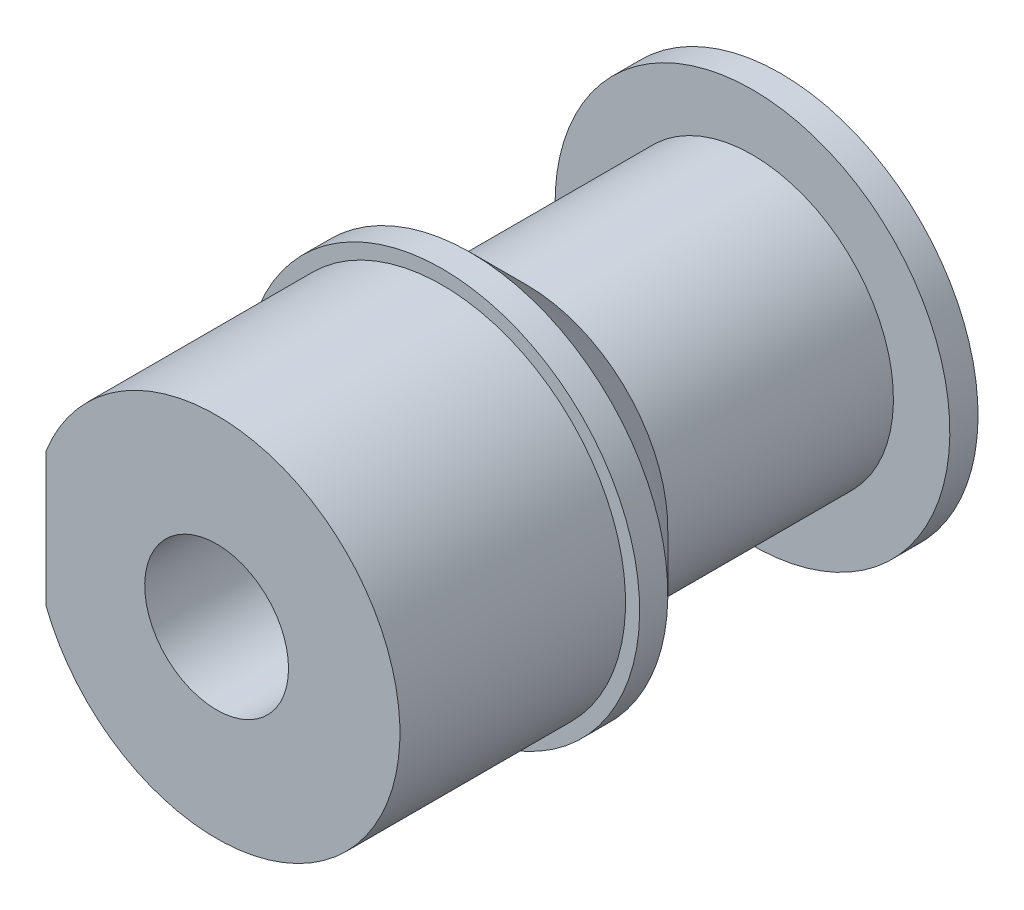
ISO-10303-21;
HEADER;
FILE_DESCRIPTION(('STEP AP214'),'2;1');
FILE_NAME('part.step','',(''),(''),'','','');
FILE_SCHEMA(('AUTOMOTIVE_DESIGN { 1 0 10303 214 1 1 1 1 }'));
ENDSEC;
DATA;
#1=APPLICATION_CONTEXT('core data for automotive mechanical design processes');
#2=APPLICATION_PROTOCOL_DEFINITION('international standard','automotive_design',2000,#1);
#3=PRODUCT_CONTEXT('',#1,'mechanical');
#4=PRODUCT('Part','Part','',(#3));
#5=PRODUCT_RELATED_PRODUCT_CATEGORY('part','',(#4));
#6=PRODUCT_DEFINITION_FORMATION('','',#4);
#7=PRODUCT_DEFINITION_CONTEXT('part definition',#1,'design');
#8=PRODUCT_DEFINITION('design','',#6,#7);
#9=PRODUCT_DEFINITION_SHAPE('','',#8);
#10=(LENGTH_UNIT() NAMED_UNIT(*) SI_UNIT(.MILLI.,.METRE.));
#11=(NAMED_UNIT(*) PLANE_ANGLE_UNIT() SI_UNIT($,.RADIAN.));
#12=(NAMED_UNIT(*) SI_UNIT($,.STERADIAN.) SOLID_ANGLE_UNIT());
#13=UNCERTAINTY_MEASURE_WITH_UNIT(LENGTH_MEASURE(1.E-05),#10,'distance_accuracy_value','');
#14=(GEOMETRIC_REPRESENTATION_CONTEXT(3) GLOBAL_UNCERTAINTY_ASSIGNED_CONTEXT((#13)) GLOBAL_UNIT_ASSIGNED_CONTEXT((#10,
#11,#12)) REPRESENTATION_CONTEXT('',''));
#15=CARTESIAN_POINT('',(0.,0.,0.));
#16=DIRECTION('',(0.,0.,1.));
#17=DIRECTION('',(1.,0.,0.));
#18=AXIS2_PLACEMENT_3D('',#15,#16,#17);
#19=CARTESIAN_POINT('',(0.,7.,0.));
#20=DIRECTION('',(0.,0.,-1.));
#21=DIRECTION('',(0.,1.,0.));
#22=AXIS2_PLACEMENT_3D('',#19,#20,#21);
#23=PLANE('',#22);
#24=CARTESIAN_POINT('',(0.,0.,0.));
#25=DIRECTION('',(0.,0.,-1.));
#26=DIRECTION('',(0.,1.,0.));
#27=AXIS2_PLACEMENT_3D('',#24,#25,#26);
#28=CIRCLE('',#27,7.);
#29=CARTESIAN_POINT('',(0.,7.,0.));
#30=VERTEX_POINT('',#29);
#31=EDGE_CURVE('E99',#30,#30,#28,.T.);
#32=ORIENTED_EDGE('',*,*,#31,.T.);
#33=EDGE_LOOP('',(#32));
#34=FACE_BOUND('',#33,.T.);
#35=DIRECTION('',(0.,1.,0.));
#36=VECTOR('',#35,1.);
#37=CARTESIAN_POINT('',(-2.05,7.,0.));
#38=LINE('',#37,#36);
#39=CARTESIAN_POINT('',(-2.05,1.51657508881031,0.));
#40=VERTEX_POINT('',#39);
#41=CARTESIAN_POINT('',(-2.05,-1.51657508881031,0.));
#42=VERTEX_POINT('',#41);
#43=EDGE_CURVE('E91',#40,#42,#38,.F.);
#44=ORIENTED_EDGE('',*,*,#43,.T.);
#45=CARTESIAN_POINT('',(0.,0.,0.));
#46=DIRECTION('',(0.,0.,-1.));
#47=DIRECTION('',(-1.,0.,0.));
#48=AXIS2_PLACEMENT_3D('',#45,#46,#47);
#49=CIRCLE('',#48,2.55);
#50=EDGE_CURVE('E36',#42,#40,#49,.F.);
#51=ORIENTED_EDGE('',*,*,#50,.T.);
#52=EDGE_LOOP('',(#44,#51));
#53=FACE_BOUND('',#52,.T.);
#54=ADVANCED_FACE('F33',(#34,#53),#23,.T.);
#55=CARTESIAN_POINT('',(0.,6.5,20.));
#56=DIRECTION('',(0.,0.,1.));
#57=DIRECTION('',(0.,-1.,0.));
#58=AXIS2_PLACEMENT_3D('',#55,#56,#57);
#59=PLANE('',#58);
#60=CARTESIAN_POINT('',(0.,0.,20.));
#61=DIRECTION('',(0.,0.,1.));
#62=DIRECTION('',(1.,0.,0.));
#63=AXIS2_PLACEMENT_3D('',#60,#61,#62);
#64=CIRCLE('',#63,2.55);
#65=CARTESIAN_POINT('',(2.55,0.,20.));
#66=VERTEX_POINT('',#65);
#67=EDGE_CURVE('E94',#66,#66,#64,.T.);
#68=ORIENTED_EDGE('',*,*,#67,.F.);
#69=EDGE_LOOP('',(#68));
#70=FACE_BOUND('',#69,.T.);
#71=DIRECTION('',(0.,1.,0.));
#72=VECTOR('',#71,1.);
#73=CARTESIAN_POINT('',(-6.05,-2.37644692766323,20.));
#74=LINE('',#73,#72);
#75=CARTESIAN_POINT('',(-6.05,-2.37644692766323,20.));
#76=VERTEX_POINT('',#75);
#77=CARTESIAN_POINT('',(-6.05,2.37644692766323,20.));
#78=VERTEX_POINT('',#77);
#79=EDGE_CURVE('E81',#76,#78,#74,.T.);
#80=ORIENTED_EDGE('',*,*,#79,.F.);
#81=CARTESIAN_POINT('',(0.,0.,20.));
#82=DIRECTION('',(0.,0.,-1.));
#83=DIRECTION('',(0.,1.,0.));
#84=AXIS2_PLACEMENT_3D('',#81,#82,#83);
#85=CIRCLE('',#84,6.5);
#86=EDGE_CURVE('E11',#78,#76,#85,.T.);
#87=ORIENTED_EDGE('',*,*,#86,.F.);
#88=EDGE_LOOP('',(#80,#87));
#89=FACE_BOUND('',#88,.T.);
#90=ADVANCED_FACE('F135',(#70,#89),#59,.T.);
#91=CARTESIAN_POINT('',(0.,0.,0.));
#92=DIRECTION('',(0.,0.,-1.));
#93=DIRECTION('',(0.,1.,0.));
#94=AXIS2_PLACEMENT_3D('',#91,#92,#93);
#95=CYLINDRICAL_SURFACE('',#94,6.5);
#96=DIRECTION('',(0.,0.,1.));
#97=VECTOR('',#96,1.);
#98=CARTESIAN_POINT('',(-6.05,-2.37644692766323,7.22585086114813));
#99=LINE('',#98,#97);
#100=CARTESIAN_POINT('',(-6.05,-2.37644692766323,12.));
#101=VERTEX_POINT('',#100);
#102=EDGE_CURVE('E126',#101,#76,#99,.T.);
#103=ORIENTED_EDGE('',*,*,#102,.F.);
#104=CARTESIAN_POINT('',(0.,0.,12.));
#105=DIRECTION('',(0.,0.,-1.));
#106=DIRECTION('',(0.,1.,0.));
#107=AXIS2_PLACEMENT_3D('',#104,#105,#106);
#108=CIRCLE('',#107,6.5);
#109=CARTESIAN_POINT('',(-6.05,2.37644692766323,12.));
#110=VERTEX_POINT('',#109);
#111=EDGE_CURVE('E41',#110,#101,#108,.T.);
#112=ORIENTED_EDGE('',*,*,#111,.F.);
#113=DIRECTION('',(0.,0.,1.));
#114=VECTOR('',#113,1.);
#115=CARTESIAN_POINT('',(-6.05,2.37644692766323,7.22585086114813));
#116=LINE('',#115,#114);
#117=EDGE_CURVE('E124',#110,#78,#116,.T.);
#118=ORIENTED_EDGE('',*,*,#117,.T.);
#119=ORIENTED_EDGE('',*,*,#86,.T.);
#120=EDGE_LOOP('',(#103,#112,#118,#119));
#121=FACE_BOUND('',#120,.T.);
#122=ADVANCED_FACE('F123',(#121),#95,.T.);
#123=CARTESIAN_POINT('',(0.,7.,12.));
#124=DIRECTION('',(0.,0.,1.));
#125=DIRECTION('',(0.,-1.,0.));
#126=AXIS2_PLACEMENT_3D('',#123,#124,#125);
#127=PLANE('',#126);
#128=ORIENTED_EDGE('',*,*,#111,.T.);
#129=DIRECTION('',(0.,-1.,0.));
#130=VECTOR('',#129,1.);
#131=CARTESIAN_POINT('',(-6.05,-2.37644692766323,12.));
#132=LINE('',#131,#130);
#133=EDGE_CURVE('E55',#110,#101,#132,.T.);
#134=ORIENTED_EDGE('',*,*,#133,.F.);
#135=EDGE_LOOP('',(#128,#134));
#136=FACE_BOUND('',#135,.T.);
#137=CARTESIAN_POINT('',(0.,0.,12.));
#138=DIRECTION('',(0.,0.,-1.));
#139=DIRECTION('',(0.,1.,0.));
#140=AXIS2_PLACEMENT_3D('',#137,#138,#139);
#141=CIRCLE('',#140,7.);
#142=CARTESIAN_POINT('',(0.,7.,12.));
#143=VERTEX_POINT('',#142);
#144=EDGE_CURVE('E114',#143,#143,#141,.T.);
#145=ORIENTED_EDGE('',*,*,#144,.F.);
#146=EDGE_LOOP('',(#145));
#147=FACE_BOUND('',#146,.T.);
#148=ADVANCED_FACE('F118',(#136,#147),#127,.T.);
#149=CARTESIAN_POINT('',(0.,0.,0.));
#150=DIRECTION('',(0.,0.,-1.));
#151=DIRECTION('',(0.,1.,0.));
#152=AXIS2_PLACEMENT_3D('',#149,#150,#151);
#153=CYLINDRICAL_SURFACE('',#152,7.);
#154=ORIENTED_EDGE('',*,*,#144,.T.);
#155=EDGE_LOOP('',(#154));
#156=FACE_BOUND('',#155,.T.);
#157=CARTESIAN_POINT('',(0.,0.,11.));
#158=DIRECTION('',(0.,0.,-1.));
#159=DIRECTION('',(0.,1.,0.));
#160=AXIS2_PLACEMENT_3D('',#157,#158,#159);
#161=CIRCLE('',#160,7.);
#162=CARTESIAN_POINT('',(0.,7.,11.));
#163=VERTEX_POINT('',#162);
#164=EDGE_CURVE('E111',#163,#163,#161,.T.);
#165=ORIENTED_EDGE('',*,*,#164,.F.);
#166=EDGE_LOOP('',(#165));
#167=FACE_BOUND('',#166,.T.);
#168=ADVANCED_FACE('F176',(#156,#167),#153,.T.);
#169=CARTESIAN_POINT('',(0.,0.,8.99999999999998));
#170=DIRECTION('',(0.,0.,1.));
#171=DIRECTION('',(0.,-1.,0.));
#172=AXIS2_PLACEMENT_3D('',#169,#170,#171);
#173=CONICAL_SURFACE('',#172,5.,0.785398163397443);
#174=ORIENTED_EDGE('',*,*,#164,.T.);
#175=EDGE_LOOP('',(#174));
#176=FACE_BOUND('',#175,.T.);
#177=CARTESIAN_POINT('',(0.,0.,8.99999999999998));
#178=DIRECTION('',(0.,0.,-1.));
#179=DIRECTION('',(0.,1.,0.));
#180=AXIS2_PLACEMENT_3D('',#177,#178,#179);
#181=CIRCLE('',#180,5.);
#182=CARTESIAN_POINT('',(0.,5.,8.99999999999998));
#183=VERTEX_POINT('',#182);
#184=EDGE_CURVE('E108',#183,#183,#181,.T.);
#185=ORIENTED_EDGE('',*,*,#184,.F.);
#186=EDGE_LOOP('',(#185));
#187=FACE_BOUND('',#186,.T.);
#188=ADVANCED_FACE('F172',(#176,#187),#173,.T.);
#189=CARTESIAN_POINT('',(0.,0.,0.));
#190=DIRECTION('',(0.,0.,-1.));
#191=DIRECTION('',(0.,1.,0.));
#192=AXIS2_PLACEMENT_3D('',#189,#190,#191);
#193=CYLINDRICAL_SURFACE('',#192,5.);
#194=ORIENTED_EDGE('',*,*,#184,.T.);
#195=EDGE_LOOP('',(#194));
#196=FACE_BOUND('',#195,.T.);
#197=CARTESIAN_POINT('',(0.,0.,0.999999999999999));
#198=DIRECTION('',(0.,0.,-1.));
#199=DIRECTION('',(0.,1.,0.));
#200=AXIS2_PLACEMENT_3D('',#197,#198,#199);
#201=CIRCLE('',#200,5.);
#202=CARTESIAN_POINT('',(0.,5.,1.));
#203=VERTEX_POINT('',#202);
#204=EDGE_CURVE('E105',#203,#203,#201,.T.);
#205=ORIENTED_EDGE('',*,*,#204,.F.);
#206=EDGE_LOOP('',(#205));
#207=FACE_BOUND('',#206,.T.);
#208=ADVANCED_FACE('F166',(#196,#207),#193,.T.);
#209=CARTESIAN_POINT('',(0.,5.,1.));
#210=DIRECTION('',(0.,0.,1.));
#211=DIRECTION('',(0.,-1.,0.));
#212=AXIS2_PLACEMENT_3D('',#209,#210,#211);
#213=PLANE('',#212);
#214=ORIENTED_EDGE('',*,*,#204,.T.);
#215=EDGE_LOOP('',(#214));
#216=FACE_BOUND('',#215,.T.);
#217=CARTESIAN_POINT('',(0.,0.,0.999999999999999));
#218=DIRECTION('',(0.,0.,-1.));
#219=DIRECTION('',(0.,1.,0.));
#220=AXIS2_PLACEMENT_3D('',#217,#218,#219);
#221=CIRCLE('',#220,7.);
#222=CARTESIAN_POINT('',(0.,7.,1.));
#223=VERTEX_POINT('',#222);
#224=EDGE_CURVE('E102',#223,#223,#221,.T.);
#225=ORIENTED_EDGE('',*,*,#224,.F.);
#226=EDGE_LOOP('',(#225));
#227=FACE_BOUND('',#226,.T.);
#228=ADVANCED_FACE('F158',(#216,#227),#213,.T.);
#229=CARTESIAN_POINT('',(0.,0.,0.));
#230=DIRECTION('',(0.,0.,-1.));
#231=DIRECTION('',(0.,1.,0.));
#232=AXIS2_PLACEMENT_3D('',#229,#230,#231);
#233=CYLINDRICAL_SURFACE('',#232,7.);
#234=ORIENTED_EDGE('',*,*,#224,.T.);
#235=EDGE_LOOP('',(#234));
#236=FACE_BOUND('',#235,.T.);
#237=ORIENTED_EDGE('',*,*,#31,.F.);
#238=EDGE_LOOP('',(#237));
#239=FACE_BOUND('',#238,.T.);
#240=ADVANCED_FACE('F156',(#236,#239),#233,.T.);
#241=CARTESIAN_POINT('',(0.,0.,20.));
#242=DIRECTION('',(0.,0.,-1.));
#243=DIRECTION('',(-1.,0.,0.));
#244=AXIS2_PLACEMENT_3D('',#241,#242,#243);
#245=CYLINDRICAL_SURFACE('',#244,2.55);
#246=CARTESIAN_POINT('',(-2.05,-1.51657508881031,13.155447685774));
#247=CARTESIAN_POINT('',(-2.02891316521274,-1.54508191891345,13.1932364635602));
#248=CARTESIAN_POINT('',(-2.00792541861758,-1.57220305734979,13.2320939589929));
#249=CARTESIAN_POINT('',(-1.96657048585223,-1.62363522399434,13.3120320867359));
#250=CARTESIAN_POINT('',(-1.94620423417867,-1.64794216056287,13.3531158316316));
#251=CARTESIAN_POINT('',(-1.88628772615246,-1.71701604687621,13.4806831730361));
#252=CARTESIAN_POINT('',(-1.84845020950711,-1.75724430008383,13.5705740408592));
#253=CARTESIAN_POINT('',(-1.79019791728807,-1.81631782096948,13.7370698747199));
#254=CARTESIAN_POINT('',(-1.76777751625249,-1.83795304477958,13.8119759166105));
#255=CARTESIAN_POINT('',(-1.73171009276087,-1.87197773526153,13.9655801787149));
#256=CARTESIAN_POINT('',(-1.71801632410811,-1.88441652320768,14.0442557241058));
#257=CARTESIAN_POINT('',(-1.70154132169322,-1.8993152094288,14.2044973009996));
#258=CARTESIAN_POINT('',(-1.69886285659446,-1.90168113885798,14.2860834218567));
#259=CARTESIAN_POINT('',(-1.70526961050241,-1.89593418136493,14.4485194305659));
#260=CARTESIAN_POINT('',(-1.71437486063125,-1.88780345124265,14.5293678288751));
#261=CARTESIAN_POINT('',(-1.74405171105184,-1.86043434148832,14.6957604873295));
#262=CARTESIAN_POINT('',(-1.76571284326509,-1.8401331211038,14.7809243208519));
#263=CARTESIAN_POINT('',(-1.81737049488361,-1.78912489612647,14.9453466539577));
#264=CARTESIAN_POINT('',(-1.84737708293987,-1.75840531206942,15.0245978726655));
#265=CARTESIAN_POINT('',(-1.9059891292235,-1.69446639341151,15.162201457987));
#266=CARTESIAN_POINT('',(-1.93377582849139,-1.66283344788549,15.2216620363528));
#267=CARTESIAN_POINT('',(-1.99097445503392,-1.59390344880669,15.3363126280613));
#268=CARTESIAN_POINT('',(-2.02038590792129,-1.5566080430477,15.3915038767624));
#269=CARTESIAN_POINT('',(-2.09825022375048,-1.45134941874037,15.5309841038762));
#270=CARTESIAN_POINT('',(-2.14703837687776,-1.37885660682465,15.6117275510788));
#271=CARTESIAN_POINT('',(-2.24117339076364,-1.21991185030442,15.7607086500428));
#272=CARTESIAN_POINT('',(-2.28651810217778,-1.13345129082939,15.8289385280123));
#273=CARTESIAN_POINT('',(-2.36302982431917,-0.962250732697227,15.9409746604727));
#274=CARTESIAN_POINT('',(-2.3953046721511,-0.879428869063853,15.9869399710977));
#275=CARTESIAN_POINT('',(-2.45211664291188,-0.705659972329218,16.0666803617228));
#276=CARTESIAN_POINT('',(-2.47666174555919,-0.614721443714835,16.1004680184336));
#277=CARTESIAN_POINT('',(-2.51602583949441,-0.425985531143359,16.1542452893899));
#278=CARTESIAN_POINT('',(-2.53076958169868,-0.328141319728791,16.1741282103503));
#279=CARTESIAN_POINT('',(-2.54865581544681,-0.129502286516475,16.1982135502603));
#280=CARTESIAN_POINT('',(-2.55180575105563,-0.0287093999065404,16.2024260307883));
#281=CARTESIAN_POINT('',(-2.5465392716676,0.159212390684938,16.1953527345001));
#282=CARTESIAN_POINT('',(-2.53953123900058,0.246461644977037,16.1859542418212));
#283=CARTESIAN_POINT('',(-2.51702923588276,0.417764343853002,16.1555432974004));
#284=CARTESIAN_POINT('',(-2.50153423304394,0.501817398308178,16.1345294327167));
#285=CARTESIAN_POINT('',(-2.46307611729618,0.665506394331268,16.0817332716425));
#286=CARTESIAN_POINT('',(-2.44004545049272,0.745094452336505,16.0498534548061));
#287=CARTESIAN_POINT('',(-2.38812179636748,0.897708347560284,15.9766898418489));
#288=CARTESIAN_POINT('',(-2.35922784873812,0.970733106989416,15.935404505125));
#289=CARTESIAN_POINT('',(-2.29249005570807,1.12011709372956,15.8376866394812));
#290=CARTESIAN_POINT('',(-2.25395326916474,1.19527956470115,15.7799033709513));
#291=CARTESIAN_POINT('',(-2.17383564065425,1.33546843097867,15.6547596834895));
#292=CARTESIAN_POINT('',(-2.13224963789109,1.40047703049765,15.5873828370778));
#293=CARTESIAN_POINT('',(-2.04069774027833,1.53153665117177,15.4299780148684));
#294=CARTESIAN_POINT('',(-1.99067551122859,1.59533005617903,15.3380934353215));
#295=CARTESIAN_POINT('',(-1.89601304579014,1.70673779869982,15.1424245717451));
#296=CARTESIAN_POINT('',(-1.85136516424484,1.75437529816454,15.0386576110657));
#297=CARTESIAN_POINT('',(-1.78843766908826,1.81804072731101,14.8572663722936));
#298=CARTESIAN_POINT('',(-1.7663601724776,1.83930774525193,14.7828152984404));
#299=CARTESIAN_POINT('',(-1.73089018696622,1.87273210082471,14.6300564484129));
#300=CARTESIAN_POINT('',(-1.71746493840185,1.88492382739525,14.5517644419561));
#301=CARTESIAN_POINT('',(-1.70368821982288,1.89736703848994,14.4153344024565));
#302=CARTESIAN_POINT('',(-1.70073435587938,1.90000069124712,14.3576670834461));
#303=CARTESIAN_POINT('',(-1.70073583651409,1.89999937789224,14.24810084669));
#304=CARTESIAN_POINT('',(-1.70312968619928,1.89786503760464,14.1962018841782));
#305=CARTESIAN_POINT('',(-1.71249633498902,1.88941616135733,14.0931518094108));
#306=CARTESIAN_POINT('',(-1.71947203181667,1.88309897999969,14.0420011913765));
#307=CARTESIAN_POINT('',(-1.74403232880551,1.86045854589339,13.9044380475018));
#308=CARTESIAN_POINT('',(-1.76564208193687,1.84020084626122,13.8193704234121));
#309=CARTESIAN_POINT('',(-1.81727118841856,1.78922505222302,13.6548995398507));
#310=CARTESIAN_POINT('',(-1.84732795801864,1.75846028293918,13.5755235009722));
#311=CARTESIAN_POINT('',(-1.90610419805463,1.69433974489387,13.4375234869527));
#312=CARTESIAN_POINT('',(-1.93401422534689,1.66255634342971,13.377802249154));
#313=CARTESIAN_POINT('',(-1.9912528102235,1.59355766559536,13.2631871757405));
#314=CARTESIAN_POINT('',(-2.02056581841401,1.55639547776603,13.208253719766));
#315=CARTESIAN_POINT('',(-2.05,1.51657508881031,13.155447685774));
#316=B_SPLINE_CURVE_WITH_KNOTS('',3,(#246,#247,#248,#249,#250,#251,#252,#253,#254,#255,#256,
#257,#258,#259,#260,#261,#262,#263,#264,#265,#266,#267,#268,#269,#270,#271,#272,#273,#274,#275,
#276,#277,#278,#279,#280,#281,#282,#283,#284,#285,#286,#287,#288,#289,#290,#291,#292,#293,#294,
#295,#296,#297,#298,#299,#300,#301,#302,#303,#304,#305,#306,#307,#308,#309,#310,#311,#312,#313,
#314,#315),.UNSPECIFIED.,.F.,.F.,(4,2,2,2,2,2,2,2,2,2,2,2,2,2,2,2,2,2,2,2,2,2,2,2,2,2,2,2,2,2,2,
2,2,2,4),(0.,0.155377795410207,0.310978734586566,0.625926071609307,0.86844164169545,
1.10964695309452,1.35309758444585,1.59696260129548,1.86607534402975,2.13551418580064,
2.35371290923888,2.57184825743297,2.92725605890404,3.28288390761518,3.58188565446867,
3.88057771051069,4.18153725043043,4.48230351874794,4.74514446438358,5.00801739011572,
5.27331455779817,5.53865521185137,5.84455798232596,6.15099100685603,6.51703884685166,
6.88255966089181,7.12326006984788,7.36304368541933,7.53593435151822,7.69153228797575,
7.8472287249764,8.11590001093792,8.38578066586843,8.60496362024565,8.82211460955656),.UNSPECIFIED.);
#317=CARTESIAN_POINT('',(-2.05,-1.51657508881031,13.155447685774));
#318=VERTEX_POINT('',#317);
#319=CARTESIAN_POINT('',(-2.05,1.51657508881031,13.155447685774));
#320=VERTEX_POINT('',#319);
#321=EDGE_CURVE('E48',#318,#320,#316,.T.);
#322=ORIENTED_EDGE('',*,*,#321,.T.);
#323=DIRECTION('',(0.,0.,-1.));
#324=VECTOR('',#323,1.);
#325=CARTESIAN_POINT('',(-2.05,1.51657508881031,20.));
#326=LINE('',#325,#324);
#327=EDGE_CURVE('E78',#320,#40,#326,.T.);
#328=ORIENTED_EDGE('',*,*,#327,.T.);
#329=ORIENTED_EDGE('',*,*,#50,.F.);
#330=DIRECTION('',(0.,0.,-1.));
#331=VECTOR('',#330,1.);
#332=CARTESIAN_POINT('',(-2.05,-1.51657508881031,20.));
#333=LINE('',#332,#331);
#334=EDGE_CURVE('E80',#318,#42,#333,.T.);
#335=ORIENTED_EDGE('',*,*,#334,.F.);
#336=EDGE_LOOP('',(#322,#328,#329,#335));
#337=FACE_BOUND('',#336,.T.);
#338=ORIENTED_EDGE('',*,*,#67,.T.);
#339=EDGE_LOOP('',(#338));
#340=FACE_BOUND('',#339,.T.);
#341=ADVANCED_FACE('F74',(#337,#340),#245,.F.);
#342=CARTESIAN_POINT('',(-2.05,1.51657508881031,20.));
#343=DIRECTION('',(1.,0.,0.));
#344=DIRECTION('',(0.,0.,-1.));
#345=AXIS2_PLACEMENT_3D('',#342,#343,#344);
#346=PLANE('',#345);
#347=CARTESIAN_POINT('',(-2.05,0.,14.3));
#348=DIRECTION('',(1.,0.,0.));
#349=DIRECTION('',(0.,0.,-1.));
#350=AXIS2_PLACEMENT_3D('',#347,#348,#349);
#351=CIRCLE('',#350,1.9);
#352=EDGE_CURVE('E82',#320,#318,#351,.F.);
#353=ORIENTED_EDGE('',*,*,#352,.T.);
#354=ORIENTED_EDGE('',*,*,#334,.T.);
#355=ORIENTED_EDGE('',*,*,#43,.F.);
#356=ORIENTED_EDGE('',*,*,#327,.F.);
#357=EDGE_LOOP('',(#353,#354,#355,#356));
#358=FACE_BOUND('',#357,.T.);
#359=ADVANCED_FACE('F89',(#358),#346,.T.);
#360=CARTESIAN_POINT('',(-6.05,-2.37644692766323,7.22585086114813));
#361=DIRECTION('',(1.,0.,0.));
#362=DIRECTION('',(0.,0.,-1.));
#363=AXIS2_PLACEMENT_3D('',#360,#361,#362);
#364=PLANE('',#363);
#365=CARTESIAN_POINT('',(-6.05,0.,14.3));
#366=DIRECTION('',(-1.,0.,0.));
#367=DIRECTION('',(0.,0.,1.));
#368=AXIS2_PLACEMENT_3D('',#365,#366,#367);
#369=CIRCLE('',#368,1.9);
#370=CARTESIAN_POINT('',(-6.05,0.,16.2));
#371=VERTEX_POINT('',#370);
#372=EDGE_CURVE('E87',#371,#371,#369,.T.);
#373=ORIENTED_EDGE('',*,*,#372,.F.);
#374=EDGE_LOOP('',(#373));
#375=FACE_BOUND('',#374,.T.);
#376=ORIENTED_EDGE('',*,*,#133,.T.);
#377=ORIENTED_EDGE('',*,*,#102,.T.);
#378=ORIENTED_EDGE('',*,*,#79,.T.);
#379=ORIENTED_EDGE('',*,*,#117,.F.);
#380=EDGE_LOOP('',(#376,#377,#378,#379));
#381=FACE_BOUND('',#380,.T.);
#382=ADVANCED_FACE('F138',(#375,#381),#364,.F.);
#383=CARTESIAN_POINT('',(7.001,0.,14.3));
#384=DIRECTION('',(-1.,0.,0.));
#385=DIRECTION('',(0.,0.,1.));
#386=AXIS2_PLACEMENT_3D('',#383,#384,#385);
#387=CYLINDRICAL_SURFACE('',#386,1.9);
#388=ORIENTED_EDGE('',*,*,#352,.F.);
#389=ORIENTED_EDGE('',*,*,#321,.F.);
#390=EDGE_LOOP('',(#388,#389));
#391=FACE_BOUND('',#390,.T.);
#392=ORIENTED_EDGE('',*,*,#372,.T.);
#393=EDGE_LOOP('',(#392));
#394=FACE_BOUND('',#393,.T.);
#395=ADVANCED_FACE('F84',(#391,#394),#387,.F.);
#396=CLOSED_SHELL('',(#54,#90,#122,#148,#168,#188,#208,#228,#240,#341,#359,#382,#395));
#397=MANIFOLD_SOLID_BREP('B2',#396);
#398=ADVANCED_BREP_SHAPE_REPRESENTATION('',(#18,#397),#14);
#399=SHAPE_DEFINITION_REPRESENTATION(#9,#398);
ENDSEC;
END-ISO-10303-21;
